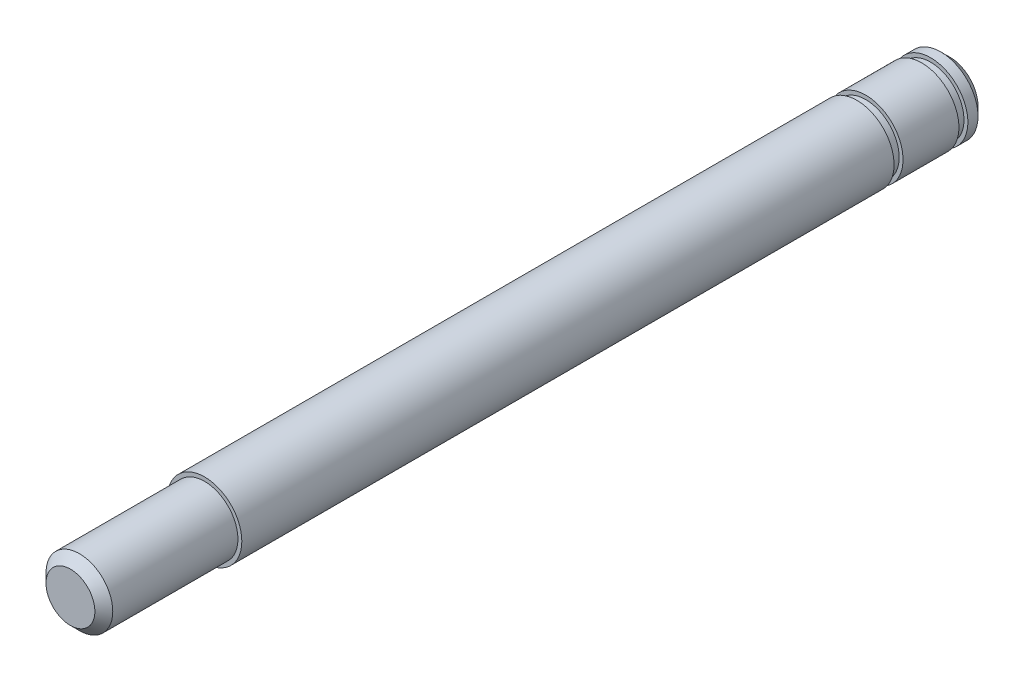
ISO-10303-21;
HEADER;
FILE_DESCRIPTION(('STEP AP214'),'2;1');
FILE_NAME('part.step','',(''),(''),'','','');
FILE_SCHEMA(('AUTOMOTIVE_DESIGN { 1 0 10303 214 1 1 1 1 }'));
ENDSEC;
DATA;
#1=APPLICATION_CONTEXT('core data for automotive mechanical design processes');
#2=APPLICATION_PROTOCOL_DEFINITION('international standard','automotive_design',2000,#1);
#3=PRODUCT_CONTEXT('',#1,'mechanical');
#4=PRODUCT('Part','Part','',(#3));
#5=PRODUCT_RELATED_PRODUCT_CATEGORY('part','',(#4));
#6=PRODUCT_DEFINITION_FORMATION('','',#4);
#7=PRODUCT_DEFINITION_CONTEXT('part definition',#1,'design');
#8=PRODUCT_DEFINITION('design','',#6,#7);
#9=PRODUCT_DEFINITION_SHAPE('','',#8);
#10=(LENGTH_UNIT() NAMED_UNIT(*) SI_UNIT(.MILLI.,.METRE.));
#11=(NAMED_UNIT(*) PLANE_ANGLE_UNIT() SI_UNIT($,.RADIAN.));
#12=(NAMED_UNIT(*) SI_UNIT($,.STERADIAN.) SOLID_ANGLE_UNIT());
#13=UNCERTAINTY_MEASURE_WITH_UNIT(LENGTH_MEASURE(1.E-05),#10,'distance_accuracy_value','');
#14=(GEOMETRIC_REPRESENTATION_CONTEXT(3) GLOBAL_UNCERTAINTY_ASSIGNED_CONTEXT((#13)) GLOBAL_UNIT_ASSIGNED_CONTEXT((#10,
#11,#12)) REPRESENTATION_CONTEXT('',''));
#15=CARTESIAN_POINT('',(0.,0.,0.));
#16=DIRECTION('',(0.,0.,1.));
#17=DIRECTION('',(1.,0.,0.));
#18=AXIS2_PLACEMENT_3D('',#15,#16,#17);
#19=CARTESIAN_POINT('',(0.,0.,15.875));
#20=DIRECTION('',(0.,0.,-1.));
#21=DIRECTION('',(-1.,0.,0.));
#22=AXIS2_PLACEMENT_3D('',#19,#20,#21);
#23=CYLINDRICAL_SURFACE('',#22,1.5875);
#24=CARTESIAN_POINT('',(0.,0.,-12.29995));
#25=DIRECTION('',(0.,0.,-1.));
#26=DIRECTION('',(-1.,0.,0.));
#27=AXIS2_PLACEMENT_3D('',#24,#25,#26);
#28=CIRCLE('',#27,1.5875);
#29=CARTESIAN_POINT('',(-1.5875,0.,-12.29995));
#30=VERTEX_POINT('',#29);
#31=EDGE_CURVE('E92',#30,#30,#28,.T.);
#32=ORIENTED_EDGE('',*,*,#31,.T.);
#33=EDGE_LOOP('',(#32));
#34=FACE_BOUND('',#33,.T.);
#35=CARTESIAN_POINT('',(0.,0.,-14.6812));
#36=DIRECTION('',(0.,0.,-1.));
#37=DIRECTION('',(-1.,0.,0.));
#38=AXIS2_PLACEMENT_3D('',#35,#36,#37);
#39=CIRCLE('',#38,1.5875);
#40=CARTESIAN_POINT('',(-1.5875,0.,-14.6812));
#41=VERTEX_POINT('',#40);
#42=EDGE_CURVE('E77',#41,#41,#39,.T.);
#43=ORIENTED_EDGE('',*,*,#42,.F.);
#44=EDGE_LOOP('',(#43));
#45=FACE_BOUND('',#44,.T.);
#46=ADVANCED_FACE('F52',(#34,#45),#23,.T.);
#47=CARTESIAN_POINT('',(0.,0.,-14.6812));
#48=DIRECTION('',(0.,0.,-1.));
#49=DIRECTION('',(-1.,0.,0.));
#50=AXIS2_PLACEMENT_3D('',#47,#48,#49);
#51=PLANE('',#50);
#52=CARTESIAN_POINT('',(0.,0.,-14.6812));
#53=DIRECTION('',(0.,0.,-1.));
#54=DIRECTION('',(-1.,0.,0.));
#55=AXIS2_PLACEMENT_3D('',#52,#53,#54);
#56=CIRCLE('',#55,1.4224);
#57=CARTESIAN_POINT('',(-1.4224,0.,-14.6812));
#58=VERTEX_POINT('',#57);
#59=EDGE_CURVE('E83',#58,#58,#56,.T.);
#60=ORIENTED_EDGE('',*,*,#59,.F.);
#61=EDGE_LOOP('',(#60));
#62=FACE_BOUND('',#61,.T.);
#63=ORIENTED_EDGE('',*,*,#42,.T.);
#64=EDGE_LOOP('',(#63));
#65=FACE_BOUND('',#64,.T.);
#66=ADVANCED_FACE('F132',(#62,#65),#51,.T.);
#67=CARTESIAN_POINT('',(0.,0.,-15.0622));
#68=DIRECTION('',(0.,0.,-1.));
#69=DIRECTION('',(-1.,0.,0.));
#70=AXIS2_PLACEMENT_3D('',#67,#68,#69);
#71=PLANE('',#70);
#72=CARTESIAN_POINT('',(0.,0.,-15.0622));
#73=DIRECTION('',(0.,0.,-1.));
#74=DIRECTION('',(-1.,0.,0.));
#75=AXIS2_PLACEMENT_3D('',#72,#73,#74);
#76=CIRCLE('',#75,1.4224);
#77=CARTESIAN_POINT('',(-1.4224,0.,-15.0622));
#78=VERTEX_POINT('',#77);
#79=EDGE_CURVE('E86',#78,#78,#76,.T.);
#80=ORIENTED_EDGE('',*,*,#79,.T.);
#81=EDGE_LOOP('',(#80));
#82=FACE_BOUND('',#81,.T.);
#83=CARTESIAN_POINT('',(0.,0.,-15.0622));
#84=DIRECTION('',(0.,0.,-1.));
#85=DIRECTION('',(-1.,0.,0.));
#86=AXIS2_PLACEMENT_3D('',#83,#84,#85);
#87=CIRCLE('',#86,1.5875);
#88=CARTESIAN_POINT('',(-1.5875,0.,-15.0622));
#89=VERTEX_POINT('',#88);
#90=EDGE_CURVE('E80',#89,#89,#87,.T.);
#91=ORIENTED_EDGE('',*,*,#90,.F.);
#92=EDGE_LOOP('',(#91));
#93=FACE_BOUND('',#92,.T.);
#94=ADVANCED_FACE('F146',(#82,#93),#71,.F.);
#95=CARTESIAN_POINT('',(0.,0.,-14.6812));
#96=DIRECTION('',(0.,0.,-1.));
#97=DIRECTION('',(-1.,0.,0.));
#98=AXIS2_PLACEMENT_3D('',#95,#96,#97);
#99=CYLINDRICAL_SURFACE('',#98,1.4224);
#100=CARTESIAN_POINT('',(-1.4224,0.,-14.6812));
#101=CARTESIAN_POINT('',(-1.4224,0.,-14.68516875));
#102=CARTESIAN_POINT('',(-1.4224,0.,-14.6891375));
#103=CARTESIAN_POINT('',(-1.4224,0.,-14.697075));
#104=CARTESIAN_POINT('',(-1.4224,0.,-14.70104375));
#105=CARTESIAN_POINT('',(-1.4224,0.,-14.70898125));
#106=CARTESIAN_POINT('',(-1.4224,0.,-14.71295));
#107=CARTESIAN_POINT('',(-1.4224,0.,-14.7208875));
#108=CARTESIAN_POINT('',(-1.4224,0.,-14.72485625));
#109=CARTESIAN_POINT('',(-1.4224,0.,-14.73279375));
#110=CARTESIAN_POINT('',(-1.4224,0.,-14.7367625));
#111=CARTESIAN_POINT('',(-1.4224,0.,-14.7447));
#112=CARTESIAN_POINT('',(-1.4224,0.,-14.74866875));
#113=CARTESIAN_POINT('',(-1.4224,0.,-14.75660625));
#114=CARTESIAN_POINT('',(-1.4224,0.,-14.760575));
#115=CARTESIAN_POINT('',(-1.4224,0.,-14.7685125));
#116=CARTESIAN_POINT('',(-1.4224,0.,-14.77248125));
#117=CARTESIAN_POINT('',(-1.4224,0.,-14.78041875));
#118=CARTESIAN_POINT('',(-1.4224,0.,-14.7843875));
#119=CARTESIAN_POINT('',(-1.4224,0.,-14.792325));
#120=CARTESIAN_POINT('',(-1.4224,0.,-14.79629375));
#121=CARTESIAN_POINT('',(-1.4224,0.,-14.80423125));
#122=CARTESIAN_POINT('',(-1.4224,0.,-14.8082));
#123=CARTESIAN_POINT('',(-1.4224,0.,-14.8161375));
#124=CARTESIAN_POINT('',(-1.4224,0.,-14.82010625));
#125=CARTESIAN_POINT('',(-1.4224,0.,-14.82804375));
#126=CARTESIAN_POINT('',(-1.4224,0.,-14.8320125));
#127=CARTESIAN_POINT('',(-1.4224,0.,-14.83995));
#128=CARTESIAN_POINT('',(-1.4224,0.,-14.84391875));
#129=CARTESIAN_POINT('',(-1.4224,0.,-14.85185625));
#130=CARTESIAN_POINT('',(-1.4224,0.,-14.855825));
#131=CARTESIAN_POINT('',(-1.4224,0.,-14.8637625));
#132=CARTESIAN_POINT('',(-1.4224,0.,-14.86773125));
#133=CARTESIAN_POINT('',(-1.4224,0.,-14.87566875));
#134=CARTESIAN_POINT('',(-1.4224,0.,-14.8796375));
#135=CARTESIAN_POINT('',(-1.4224,0.,-14.887575));
#136=CARTESIAN_POINT('',(-1.4224,0.,-14.89154375));
#137=CARTESIAN_POINT('',(-1.4224,0.,-14.89948125));
#138=CARTESIAN_POINT('',(-1.4224,0.,-14.90345));
#139=CARTESIAN_POINT('',(-1.4224,0.,-14.9113875));
#140=CARTESIAN_POINT('',(-1.4224,0.,-14.91535625));
#141=CARTESIAN_POINT('',(-1.4224,0.,-14.92329375));
#142=CARTESIAN_POINT('',(-1.4224,0.,-14.9272625));
#143=CARTESIAN_POINT('',(-1.4224,0.,-14.9352));
#144=CARTESIAN_POINT('',(-1.4224,0.,-14.93916875));
#145=CARTESIAN_POINT('',(-1.4224,0.,-14.94710625));
#146=CARTESIAN_POINT('',(-1.4224,0.,-14.951075));
#147=CARTESIAN_POINT('',(-1.4224,0.,-14.9590125));
#148=CARTESIAN_POINT('',(-1.4224,0.,-14.96298125));
#149=CARTESIAN_POINT('',(-1.4224,0.,-14.97091875));
#150=CARTESIAN_POINT('',(-1.4224,0.,-14.9748875));
#151=CARTESIAN_POINT('',(-1.4224,0.,-14.982825));
#152=CARTESIAN_POINT('',(-1.4224,0.,-14.98679375));
#153=CARTESIAN_POINT('',(-1.4224,0.,-14.99473125));
#154=CARTESIAN_POINT('',(-1.4224,0.,-14.9987));
#155=CARTESIAN_POINT('',(-1.4224,0.,-15.0066375));
#156=CARTESIAN_POINT('',(-1.4224,0.,-15.01060625));
#157=CARTESIAN_POINT('',(-1.4224,0.,-15.01854375));
#158=CARTESIAN_POINT('',(-1.4224,0.,-15.0225125));
#159=CARTESIAN_POINT('',(-1.4224,0.,-15.03045));
#160=CARTESIAN_POINT('',(-1.4224,0.,-15.03441875));
#161=CARTESIAN_POINT('',(-1.4224,0.,-15.04235625));
#162=CARTESIAN_POINT('',(-1.4224,0.,-15.046325));
#163=CARTESIAN_POINT('',(-1.4224,0.,-15.0542625));
#164=CARTESIAN_POINT('',(-1.4224,0.,-15.05823125));
#165=CARTESIAN_POINT('',(-1.4224,0.,-15.0622));
#166=B_SPLINE_CURVE_WITH_KNOTS('',3,(#100,#101,#102,#103,#104,#105,#106,#107,#108,#109,#110,
#111,#112,#113,#114,#115,#116,#117,#118,#119,#120,#121,#122,#123,#124,#125,#126,#127,#128,#129,
#130,#131,#132,#133,#134,#135,#136,#137,#138,#139,#140,#141,#142,#143,#144,#145,#146,#147,#148,
#149,#150,#151,#152,#153,#154,#155,#156,#157,#158,#159,#160,#161,#162,#163,#164,#165),
.UNSPECIFIED.,.F.,.F.,(4,2,2,2,2,2,2,2,2,2,2,2,2,2,2,2,2,2,2,2,2,2,2,2,2,2,2,2,2,2,2,2,4),(0.,
0.0119062500000006,0.0238125000000013,0.0357187500000002,0.0476250000000008,0.0595312500000014,
0.0714375000000003,0.083343750000001,0.0952500000000016,0.10715625,0.119062500000001,0.13096875,
0.142875000000001,0.154781250000001,0.1666875,0.178593750000001,0.190500000000001,0.20240625,
0.214312500000001,0.22621875,0.238125,0.250031250000001,0.2619375,0.273843750000001,
0.285750000000001,0.29765625,0.309562500000001,0.32146875,0.333375,0.345281250000001,0.3571875,
0.36909375,0.381000000000001),.UNSPECIFIED.);
#167=EDGE_CURVE('BSEAM140',#58,#78,#166,.T.);
#168=ORIENTED_EDGE('',*,*,#59,.T.);
#169=ORIENTED_EDGE('',*,*,#79,.F.);
#170=ORIENTED_EDGE('',*,*,#167,.T.);
#171=ORIENTED_EDGE('',*,*,#167,.F.);
#172=EDGE_LOOP('',(#168,#170,#169,#171));
#173=FACE_BOUND('',#172,.T.);
#174=ADVANCED_FACE('F140',(#173),#99,.T.);
#175=CARTESIAN_POINT('',(0.,0.,-15.875));
#176=DIRECTION('',(0.,0.,1.));
#177=DIRECTION('',(1.,0.,0.));
#178=AXIS2_PLACEMENT_3D('',#175,#176,#177);
#179=PLANE('',#178);
#180=CARTESIAN_POINT('',(0.,0.,-15.875));
#181=DIRECTION('',(0.,0.,1.));
#182=DIRECTION('',(1.,0.,0.));
#183=AXIS2_PLACEMENT_3D('',#180,#181,#182);
#184=CIRCLE('',#183,1.20650000000001);
#185=CARTESIAN_POINT('',(1.20650000000001,0.,-15.875));
#186=VERTEX_POINT('',#185);
#187=EDGE_CURVE('E64',#186,#186,#184,.F.);
#188=ORIENTED_EDGE('',*,*,#187,.T.);
#189=EDGE_LOOP('',(#188));
#190=FACE_BOUND('',#189,.T.);
#191=ADVANCED_FACE('F135',(#190),#179,.F.);
#192=CARTESIAN_POINT('',(0.,0.,-15.494));
#193=DIRECTION('',(0.,0.,1.));
#194=DIRECTION('',(1.,0.,0.));
#195=AXIS2_PLACEMENT_3D('',#192,#193,#194);
#196=CIRCLE('',#195,1.5875);
#197=CARTESIAN_POINT('',(1.5875,0.,-15.494));
#198=VERTEX_POINT('',#197);
#199=EDGE_CURVE('E68',#198,#198,#196,.T.);
#200=ORIENTED_EDGE('',*,*,#199,.T.);
#201=EDGE_LOOP('',(#200));
#202=FACE_BOUND('',#201,.T.);
#203=ORIENTED_EDGE('',*,*,#90,.T.);
#204=EDGE_LOOP('',(#203));
#205=FACE_BOUND('',#204,.T.);
#206=ADVANCED_FACE('F111',(#202,#205),#23,.T.);
#207=CARTESIAN_POINT('',(0.,0.,-11.91895));
#208=DIRECTION('',(0.,0.,-1.));
#209=DIRECTION('',(-1.,0.,0.));
#210=AXIS2_PLACEMENT_3D('',#207,#208,#209);
#211=PLANE('',#210);
#212=CARTESIAN_POINT('',(0.,0.,-11.91895));
#213=DIRECTION('',(0.,0.,-1.));
#214=DIRECTION('',(-1.,0.,0.));
#215=AXIS2_PLACEMENT_3D('',#212,#213,#214);
#216=CIRCLE('',#215,1.4224);
#217=CARTESIAN_POINT('',(-1.4224,0.,-11.91895));
#218=VERTEX_POINT('',#217);
#219=EDGE_CURVE('E95',#218,#218,#216,.T.);
#220=ORIENTED_EDGE('',*,*,#219,.F.);
#221=EDGE_LOOP('',(#220));
#222=FACE_BOUND('',#221,.T.);
#223=CARTESIAN_POINT('',(0.,0.,-11.91895));
#224=DIRECTION('',(0.,0.,-1.));
#225=DIRECTION('',(-1.,0.,0.));
#226=AXIS2_PLACEMENT_3D('',#223,#224,#225);
#227=CIRCLE('',#226,1.5875);
#228=CARTESIAN_POINT('',(-1.5875,0.,-11.91895));
#229=VERTEX_POINT('',#228);
#230=EDGE_CURVE('E89',#229,#229,#227,.T.);
#231=ORIENTED_EDGE('',*,*,#230,.T.);
#232=EDGE_LOOP('',(#231));
#233=FACE_BOUND('',#232,.T.);
#234=ADVANCED_FACE('F107',(#222,#233),#211,.T.);
#235=CARTESIAN_POINT('',(0.,0.,-12.29995));
#236=DIRECTION('',(0.,0.,-1.));
#237=DIRECTION('',(-1.,0.,0.));
#238=AXIS2_PLACEMENT_3D('',#235,#236,#237);
#239=PLANE('',#238);
#240=CARTESIAN_POINT('',(0.,0.,-12.29995));
#241=DIRECTION('',(0.,0.,-1.));
#242=DIRECTION('',(-1.,0.,0.));
#243=AXIS2_PLACEMENT_3D('',#240,#241,#242);
#244=CIRCLE('',#243,1.4224);
#245=CARTESIAN_POINT('',(-1.4224,0.,-12.29995));
#246=VERTEX_POINT('',#245);
#247=EDGE_CURVE('E98',#246,#246,#244,.T.);
#248=ORIENTED_EDGE('',*,*,#247,.T.);
#249=EDGE_LOOP('',(#248));
#250=FACE_BOUND('',#249,.T.);
#251=ORIENTED_EDGE('',*,*,#31,.F.);
#252=EDGE_LOOP('',(#251));
#253=FACE_BOUND('',#252,.T.);
#254=ADVANCED_FACE('F110',(#250,#253),#239,.F.);
#255=CARTESIAN_POINT('',(0.,0.,-11.91895));
#256=DIRECTION('',(0.,0.,-1.));
#257=DIRECTION('',(-1.,0.,0.));
#258=AXIS2_PLACEMENT_3D('',#255,#256,#257);
#259=CYLINDRICAL_SURFACE('',#258,1.4224);
#260=CARTESIAN_POINT('',(-1.4224,0.,-11.91895));
#261=CARTESIAN_POINT('',(-1.4224,0.,-11.92291875));
#262=CARTESIAN_POINT('',(-1.4224,0.,-11.9268875));
#263=CARTESIAN_POINT('',(-1.4224,0.,-11.934825));
#264=CARTESIAN_POINT('',(-1.4224,0.,-11.93879375));
#265=CARTESIAN_POINT('',(-1.4224,0.,-11.94673125));
#266=CARTESIAN_POINT('',(-1.4224,0.,-11.9507));
#267=CARTESIAN_POINT('',(-1.4224,0.,-11.9586375));
#268=CARTESIAN_POINT('',(-1.4224,0.,-11.96260625));
#269=CARTESIAN_POINT('',(-1.4224,0.,-11.97054375));
#270=CARTESIAN_POINT('',(-1.4224,0.,-11.9745125));
#271=CARTESIAN_POINT('',(-1.4224,0.,-11.98245));
#272=CARTESIAN_POINT('',(-1.4224,0.,-11.98641875));
#273=CARTESIAN_POINT('',(-1.4224,0.,-11.99435625));
#274=CARTESIAN_POINT('',(-1.4224,0.,-11.998325));
#275=CARTESIAN_POINT('',(-1.4224,0.,-12.0062625));
#276=CARTESIAN_POINT('',(-1.4224,0.,-12.01023125));
#277=CARTESIAN_POINT('',(-1.4224,0.,-12.01816875));
#278=CARTESIAN_POINT('',(-1.4224,0.,-12.0221375));
#279=CARTESIAN_POINT('',(-1.4224,0.,-12.030075));
#280=CARTESIAN_POINT('',(-1.4224,0.,-12.03404375));
#281=CARTESIAN_POINT('',(-1.4224,0.,-12.04198125));
#282=CARTESIAN_POINT('',(-1.4224,0.,-12.04595));
#283=CARTESIAN_POINT('',(-1.4224,0.,-12.0538875));
#284=CARTESIAN_POINT('',(-1.4224,0.,-12.05785625));
#285=CARTESIAN_POINT('',(-1.4224,0.,-12.06579375));
#286=CARTESIAN_POINT('',(-1.4224,0.,-12.0697625));
#287=CARTESIAN_POINT('',(-1.4224,0.,-12.0777));
#288=CARTESIAN_POINT('',(-1.4224,0.,-12.08166875));
#289=CARTESIAN_POINT('',(-1.4224,0.,-12.08960625));
#290=CARTESIAN_POINT('',(-1.4224,0.,-12.093575));
#291=CARTESIAN_POINT('',(-1.4224,0.,-12.1015125));
#292=CARTESIAN_POINT('',(-1.4224,0.,-12.10548125));
#293=CARTESIAN_POINT('',(-1.4224,0.,-12.11341875));
#294=CARTESIAN_POINT('',(-1.4224,0.,-12.1173875));
#295=CARTESIAN_POINT('',(-1.4224,0.,-12.125325));
#296=CARTESIAN_POINT('',(-1.4224,0.,-12.12929375));
#297=CARTESIAN_POINT('',(-1.4224,0.,-12.13723125));
#298=CARTESIAN_POINT('',(-1.4224,0.,-12.1412));
#299=CARTESIAN_POINT('',(-1.4224,0.,-12.1491375));
#300=CARTESIAN_POINT('',(-1.4224,0.,-12.15310625));
#301=CARTESIAN_POINT('',(-1.4224,0.,-12.16104375));
#302=CARTESIAN_POINT('',(-1.4224,0.,-12.1650125));
#303=CARTESIAN_POINT('',(-1.4224,0.,-12.17295));
#304=CARTESIAN_POINT('',(-1.4224,0.,-12.17691875));
#305=CARTESIAN_POINT('',(-1.4224,0.,-12.18485625));
#306=CARTESIAN_POINT('',(-1.4224,0.,-12.188825));
#307=CARTESIAN_POINT('',(-1.4224,0.,-12.1967625));
#308=CARTESIAN_POINT('',(-1.4224,0.,-12.20073125));
#309=CARTESIAN_POINT('',(-1.4224,0.,-12.20866875));
#310=CARTESIAN_POINT('',(-1.4224,0.,-12.2126375));
#311=CARTESIAN_POINT('',(-1.4224,0.,-12.220575));
#312=CARTESIAN_POINT('',(-1.4224,0.,-12.22454375));
#313=CARTESIAN_POINT('',(-1.4224,0.,-12.23248125));
#314=CARTESIAN_POINT('',(-1.4224,0.,-12.23645));
#315=CARTESIAN_POINT('',(-1.4224,0.,-12.2443875));
#316=CARTESIAN_POINT('',(-1.4224,0.,-12.24835625));
#317=CARTESIAN_POINT('',(-1.4224,0.,-12.25629375));
#318=CARTESIAN_POINT('',(-1.4224,0.,-12.2602625));
#319=CARTESIAN_POINT('',(-1.4224,0.,-12.2682));
#320=CARTESIAN_POINT('',(-1.4224,0.,-12.27216875));
#321=CARTESIAN_POINT('',(-1.4224,0.,-12.28010625));
#322=CARTESIAN_POINT('',(-1.4224,0.,-12.284075));
#323=CARTESIAN_POINT('',(-1.4224,0.,-12.2920125));
#324=CARTESIAN_POINT('',(-1.4224,0.,-12.29598125));
#325=CARTESIAN_POINT('',(-1.4224,0.,-12.29995));
#326=B_SPLINE_CURVE_WITH_KNOTS('',3,(#260,#261,#262,#263,#264,#265,#266,#267,#268,#269,#270,
#271,#272,#273,#274,#275,#276,#277,#278,#279,#280,#281,#282,#283,#284,#285,#286,#287,#288,#289,
#290,#291,#292,#293,#294,#295,#296,#297,#298,#299,#300,#301,#302,#303,#304,#305,#306,#307,#308,
#309,#310,#311,#312,#313,#314,#315,#316,#317,#318,#319,#320,#321,#322,#323,#324,#325),
.UNSPECIFIED.,.F.,.F.,(4,2,2,2,2,2,2,2,2,2,2,2,2,2,2,2,2,2,2,2,2,2,2,2,2,2,2,2,2,2,2,2,4),(0.,
0.0119062500000006,0.0238125000000013,0.0357187500000002,0.0476250000000008,0.0595312500000014,
0.0714375000000003,0.083343750000001,0.0952499999999998,0.10715625,0.119062500000001,0.13096875,
0.142875000000001,0.154781250000001,0.1666875,0.178593750000001,0.1905,0.20240625,
0.214312500000001,0.22621875,0.238125,0.250031250000001,0.2619375,0.273843750000001,0.28575,
0.29765625,0.309562500000001,0.32146875,0.333375,0.345281250000001,0.3571875,0.36909375,
0.380999999999999),.UNSPECIFIED.);
#327=EDGE_CURVE('BSEAM104',#218,#246,#326,.T.);
#328=ORIENTED_EDGE('',*,*,#219,.T.);
#329=ORIENTED_EDGE('',*,*,#247,.F.);
#330=ORIENTED_EDGE('',*,*,#327,.T.);
#331=ORIENTED_EDGE('',*,*,#327,.F.);
#332=EDGE_LOOP('',(#328,#330,#329,#331));
#333=FACE_BOUND('',#332,.T.);
#334=ADVANCED_FACE('F104',(#333),#259,.T.);
#335=CARTESIAN_POINT('',(0.,0.,21.59));
#336=DIRECTION('',(0.,0.,1.));
#337=DIRECTION('',(1.,0.,0.));
#338=AXIS2_PLACEMENT_3D('',#335,#336,#337);
#339=PLANE('',#338);
#340=CARTESIAN_POINT('',(0.,0.,21.59));
#341=DIRECTION('',(0.,0.,1.));
#342=DIRECTION('',(1.,0.,0.));
#343=AXIS2_PLACEMENT_3D('',#340,#341,#342);
#344=CIRCLE('',#343,1.0414);
#345=CARTESIAN_POINT('',(1.0414,0.,21.59));
#346=VERTEX_POINT('',#345);
#347=EDGE_CURVE('E60',#346,#346,#344,.T.);
#348=ORIENTED_EDGE('',*,*,#347,.T.);
#349=EDGE_LOOP('',(#348));
#350=FACE_BOUND('',#349,.T.);
#351=ADVANCED_FACE('F159',(#350),#339,.T.);
#352=CARTESIAN_POINT('',(0.,0.,21.59));
#353=DIRECTION('',(0.,0.,-1.));
#354=DIRECTION('',(-1.,0.,0.));
#355=AXIS2_PLACEMENT_3D('',#352,#353,#354);
#356=CYLINDRICAL_SURFACE('',#355,1.4224);
#357=CARTESIAN_POINT('',(0.,0.,21.209));
#358=DIRECTION('',(0.,0.,1.));
#359=DIRECTION('',(1.,0.,0.));
#360=AXIS2_PLACEMENT_3D('',#357,#358,#359);
#361=CIRCLE('',#360,1.4224);
#362=CARTESIAN_POINT('',(1.4224,0.,21.209));
#363=VERTEX_POINT('',#362);
#364=EDGE_CURVE('E11',#363,#363,#361,.F.);
#365=ORIENTED_EDGE('',*,*,#364,.T.);
#366=EDGE_LOOP('',(#365));
#367=FACE_BOUND('',#366,.T.);
#368=CARTESIAN_POINT('',(0.,0.,15.875));
#369=DIRECTION('',(0.,0.,1.));
#370=DIRECTION('',(1.,0.,0.));
#371=AXIS2_PLACEMENT_3D('',#368,#369,#370);
#372=CIRCLE('',#371,1.4224);
#373=CARTESIAN_POINT('',(1.4224,0.,15.875));
#374=VERTEX_POINT('',#373);
#375=EDGE_CURVE('E73',#374,#374,#372,.T.);
#376=ORIENTED_EDGE('',*,*,#375,.T.);
#377=EDGE_LOOP('',(#376));
#378=FACE_BOUND('',#377,.T.);
#379=ADVANCED_FACE('F126',(#367,#378),#356,.T.);
#380=CARTESIAN_POINT('',(0.,0.,15.875));
#381=DIRECTION('',(0.,0.,1.));
#382=DIRECTION('',(1.,0.,0.));
#383=AXIS2_PLACEMENT_3D('',#380,#381,#382);
#384=PLANE('',#383);
#385=ORIENTED_EDGE('',*,*,#375,.F.);
#386=EDGE_LOOP('',(#385));
#387=FACE_BOUND('',#386,.T.);
#388=CARTESIAN_POINT('',(0.,0.,15.875));
#389=DIRECTION('',(0.,0.,1.));
#390=DIRECTION('',(1.,0.,0.));
#391=AXIS2_PLACEMENT_3D('',#388,#389,#390);
#392=CIRCLE('',#391,1.5875);
#393=CARTESIAN_POINT('',(1.5875,0.,15.875));
#394=VERTEX_POINT('',#393);
#395=EDGE_CURVE('E74',#394,#394,#392,.T.);
#396=ORIENTED_EDGE('',*,*,#395,.T.);
#397=EDGE_LOOP('',(#396));
#398=FACE_BOUND('',#397,.T.);
#399=ADVANCED_FACE('F118',(#387,#398),#384,.T.);
#400=ORIENTED_EDGE('',*,*,#395,.F.);
#401=EDGE_LOOP('',(#400));
#402=FACE_BOUND('',#401,.T.);
#403=ORIENTED_EDGE('',*,*,#230,.F.);
#404=EDGE_LOOP('',(#403));
#405=FACE_BOUND('',#404,.T.);
#406=ADVANCED_FACE('F115',(#402,#405),#23,.T.);
#407=CARTESIAN_POINT('',(0.,0.,-15.494));
#408=DIRECTION('',(0.,0.,1.));
#409=DIRECTION('',(1.,0.,0.));
#410=AXIS2_PLACEMENT_3D('',#407,#408,#409);
#411=CONICAL_SURFACE('',#410,1.5875,0.78539816339745);
#412=ORIENTED_EDGE('',*,*,#187,.F.);
#413=EDGE_LOOP('',(#412));
#414=FACE_BOUND('',#413,.T.);
#415=ORIENTED_EDGE('',*,*,#199,.F.);
#416=EDGE_LOOP('',(#415));
#417=FACE_BOUND('',#416,.T.);
#418=ADVANCED_FACE('F117',(#414,#417),#411,.T.);
#419=CARTESIAN_POINT('',(0.,0.,21.59));
#420=DIRECTION('',(0.,0.,-1.));
#421=DIRECTION('',(-1.,0.,0.));
#422=AXIS2_PLACEMENT_3D('',#419,#420,#421);
#423=CONICAL_SURFACE('',#422,1.0414,0.785398163397447);
#424=ORIENTED_EDGE('',*,*,#364,.F.);
#425=EDGE_LOOP('',(#424));
#426=FACE_BOUND('',#425,.T.);
#427=ORIENTED_EDGE('',*,*,#347,.F.);
#428=EDGE_LOOP('',(#427));
#429=FACE_BOUND('',#428,.T.);
#430=ADVANCED_FACE('F55',(#426,#429),#423,.T.);
#431=CLOSED_SHELL('',(#46,#66,#94,#174,#191,#206,#234,#254,#334,#351,#379,#399,#406,#418,#430));
#432=MANIFOLD_SOLID_BREP('B2',#431);
#433=ADVANCED_BREP_SHAPE_REPRESENTATION('',(#18,#432),#14);
#434=SHAPE_DEFINITION_REPRESENTATION(#9,#433);
ENDSEC;
END-ISO-10303-21;
